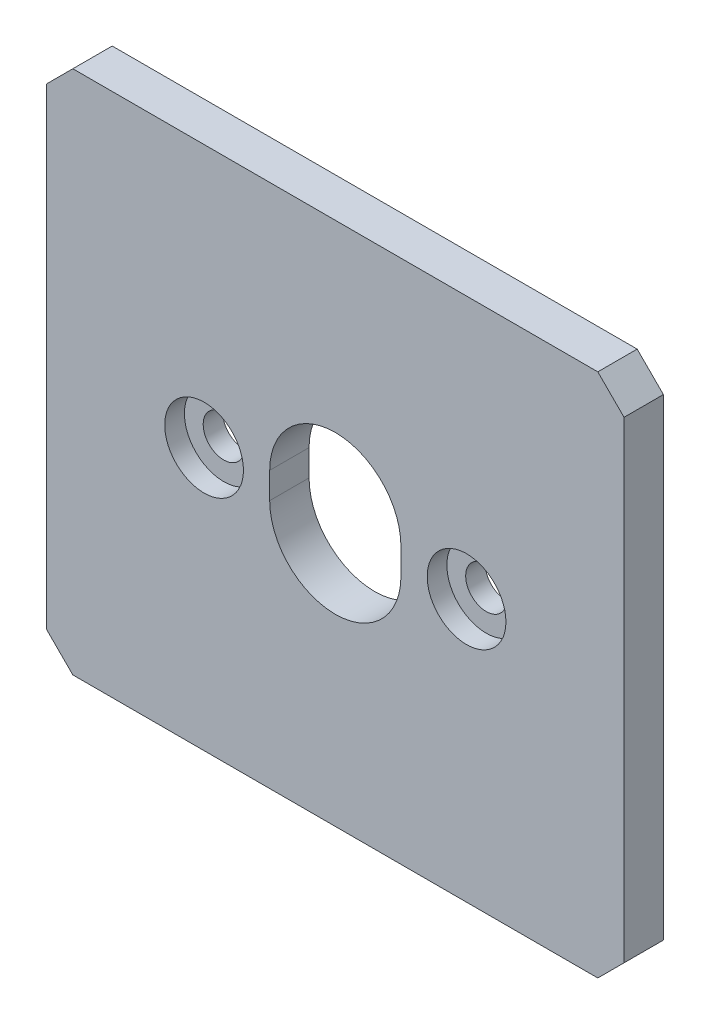
ISO-10303-21;
HEADER;
FILE_DESCRIPTION(('STEP AP214'),'2;1');
FILE_NAME('part.step','',(''),(''),'','','');
FILE_SCHEMA(('AUTOMOTIVE_DESIGN { 1 0 10303 214 1 1 1 1 }'));
ENDSEC;
DATA;
#1=APPLICATION_CONTEXT('core data for automotive mechanical design processes');
#2=APPLICATION_PROTOCOL_DEFINITION('international standard','automotive_design',2000,#1);
#3=PRODUCT_CONTEXT('',#1,'mechanical');
#4=PRODUCT('Part','Part','',(#3));
#5=PRODUCT_RELATED_PRODUCT_CATEGORY('part','',(#4));
#6=PRODUCT_DEFINITION_FORMATION('','',#4);
#7=PRODUCT_DEFINITION_CONTEXT('part definition',#1,'design');
#8=PRODUCT_DEFINITION('design','',#6,#7);
#9=PRODUCT_DEFINITION_SHAPE('','',#8);
#10=(LENGTH_UNIT() NAMED_UNIT(*) SI_UNIT(.MILLI.,.METRE.));
#11=(NAMED_UNIT(*) PLANE_ANGLE_UNIT() SI_UNIT($,.RADIAN.));
#12=(NAMED_UNIT(*) SI_UNIT($,.STERADIAN.) SOLID_ANGLE_UNIT());
#13=UNCERTAINTY_MEASURE_WITH_UNIT(LENGTH_MEASURE(1.E-05),#10,'distance_accuracy_value','');
#14=(GEOMETRIC_REPRESENTATION_CONTEXT(3) GLOBAL_UNCERTAINTY_ASSIGNED_CONTEXT((#13)) GLOBAL_UNIT_ASSIGNED_CONTEXT((#10,
#11,#12)) REPRESENTATION_CONTEXT('',''));
#15=CARTESIAN_POINT('',(0.,0.,0.));
#16=DIRECTION('',(0.,0.,1.));
#17=DIRECTION('',(1.,0.,0.));
#18=AXIS2_PLACEMENT_3D('',#15,#16,#17);
#19=CARTESIAN_POINT('',(-15.875,0.,4.7625));
#20=DIRECTION('',(0.,0.,-1.));
#21=DIRECTION('',(-1.,0.,0.));
#22=AXIS2_PLACEMENT_3D('',#19,#20,#21);
#23=CYLINDRICAL_SURFACE('',#22,2.4892);
#24=CARTESIAN_POINT('',(-15.875,0.,0.));
#25=DIRECTION('',(0.,0.,1.));
#26=DIRECTION('',(1.,0.,0.));
#27=AXIS2_PLACEMENT_3D('',#24,#25,#26);
#28=CIRCLE('',#27,2.4892);
#29=CARTESIAN_POINT('',(-18.3642,0.,0.));
#30=VERTEX_POINT('',#29);
#31=EDGE_CURVE('E161',#30,#30,#28,.T.);
#32=CARTESIAN_POINT('',(-15.875,0.,2.38125));
#33=DIRECTION('',(0.,0.,1.));
#34=DIRECTION('',(1.,0.,0.));
#35=AXIS2_PLACEMENT_3D('',#32,#33,#34);
#36=CIRCLE('',#35,2.4892);
#37=CARTESIAN_POINT('',(-18.3642,0.,2.38125));
#38=VERTEX_POINT('',#37);
#39=EDGE_CURVE('E40',#38,#38,#36,.T.);
#40=CARTESIAN_POINT('',(-18.3642,0.,0.));
#41=CARTESIAN_POINT('',(-18.3642,0.,0.0248046875));
#42=CARTESIAN_POINT('',(-18.3642,0.,0.049609375));
#43=CARTESIAN_POINT('',(-18.3642,0.,0.0992187500000001));
#44=CARTESIAN_POINT('',(-18.3642,0.,0.1240234375));
#45=CARTESIAN_POINT('',(-18.3642,0.,0.1736328125));
#46=CARTESIAN_POINT('',(-18.3642,0.,0.1984375));
#47=CARTESIAN_POINT('',(-18.3642,0.,0.248046875));
#48=CARTESIAN_POINT('',(-18.3642,0.,0.2728515625));
#49=CARTESIAN_POINT('',(-18.3642,0.,0.3224609375));
#50=CARTESIAN_POINT('',(-18.3642,0.,0.347265625));
#51=CARTESIAN_POINT('',(-18.3642,0.,0.396875));
#52=CARTESIAN_POINT('',(-18.3642,0.,0.4216796875));
#53=CARTESIAN_POINT('',(-18.3642,0.,0.4712890625));
#54=CARTESIAN_POINT('',(-18.3642,0.,0.49609375));
#55=CARTESIAN_POINT('',(-18.3642,0.,0.545703125));
#56=CARTESIAN_POINT('',(-18.3642,0.,0.5705078125));
#57=CARTESIAN_POINT('',(-18.3642,0.,0.6201171875));
#58=CARTESIAN_POINT('',(-18.3642,0.,0.644921875));
#59=CARTESIAN_POINT('',(-18.3642,0.,0.69453125));
#60=CARTESIAN_POINT('',(-18.3642,0.,0.7193359375));
#61=CARTESIAN_POINT('',(-18.3642,0.,0.7689453125));
#62=CARTESIAN_POINT('',(-18.3642,0.,0.793750000000001));
#63=CARTESIAN_POINT('',(-18.3642,0.,0.843359375));
#64=CARTESIAN_POINT('',(-18.3642,0.,0.8681640625));
#65=CARTESIAN_POINT('',(-18.3642,0.,0.9177734375));
#66=CARTESIAN_POINT('',(-18.3642,0.,0.942578125));
#67=CARTESIAN_POINT('',(-18.3642,0.,0.9921875));
#68=CARTESIAN_POINT('',(-18.3642,0.,1.0169921875));
#69=CARTESIAN_POINT('',(-18.3642,0.,1.0666015625));
#70=CARTESIAN_POINT('',(-18.3642,0.,1.09140625));
#71=CARTESIAN_POINT('',(-18.3642,0.,1.141015625));
#72=CARTESIAN_POINT('',(-18.3642,0.,1.1658203125));
#73=CARTESIAN_POINT('',(-18.3642,0.,1.2154296875));
#74=CARTESIAN_POINT('',(-18.3642,0.,1.240234375));
#75=CARTESIAN_POINT('',(-18.3642,0.,1.28984375));
#76=CARTESIAN_POINT('',(-18.3642,0.,1.3146484375));
#77=CARTESIAN_POINT('',(-18.3642,0.,1.3642578125));
#78=CARTESIAN_POINT('',(-18.3642,0.,1.3890625));
#79=CARTESIAN_POINT('',(-18.3642,0.,1.438671875));
#80=CARTESIAN_POINT('',(-18.3642,0.,1.4634765625));
#81=CARTESIAN_POINT('',(-18.3642,0.,1.5130859375));
#82=CARTESIAN_POINT('',(-18.3642,0.,1.537890625));
#83=CARTESIAN_POINT('',(-18.3642,0.,1.5875));
#84=CARTESIAN_POINT('',(-18.3642,0.,1.6123046875));
#85=CARTESIAN_POINT('',(-18.3642,0.,1.6619140625));
#86=CARTESIAN_POINT('',(-18.3642,0.,1.68671875));
#87=CARTESIAN_POINT('',(-18.3642,0.,1.736328125));
#88=CARTESIAN_POINT('',(-18.3642,0.,1.7611328125));
#89=CARTESIAN_POINT('',(-18.3642,0.,1.8107421875));
#90=CARTESIAN_POINT('',(-18.3642,0.,1.835546875));
#91=CARTESIAN_POINT('',(-18.3642,0.,1.88515625));
#92=CARTESIAN_POINT('',(-18.3642,0.,1.9099609375));
#93=CARTESIAN_POINT('',(-18.3642,0.,1.9595703125));
#94=CARTESIAN_POINT('',(-18.3642,0.,1.984375));
#95=CARTESIAN_POINT('',(-18.3642,0.,2.033984375));
#96=CARTESIAN_POINT('',(-18.3642,0.,2.0587890625));
#97=CARTESIAN_POINT('',(-18.3642,0.,2.1083984375));
#98=CARTESIAN_POINT('',(-18.3642,0.,2.133203125));
#99=CARTESIAN_POINT('',(-18.3642,0.,2.1828125));
#100=CARTESIAN_POINT('',(-18.3642,0.,2.2076171875));
#101=CARTESIAN_POINT('',(-18.3642,0.,2.2572265625));
#102=CARTESIAN_POINT('',(-18.3642,0.,2.28203125));
#103=CARTESIAN_POINT('',(-18.3642,0.,2.331640625));
#104=CARTESIAN_POINT('',(-18.3642,0.,2.3564453125));
#105=CARTESIAN_POINT('',(-18.3642,0.,2.38125));
#106=B_SPLINE_CURVE_WITH_KNOTS('',3,(#40,#41,#42,#43,#44,#45,#46,#47,#48,#49,#50,#51,#52,#53,
#54,#55,#56,#57,#58,#59,#60,#61,#62,#63,#64,#65,#66,#67,#68,#69,#70,#71,#72,#73,#74,#75,#76,#77,
#78,#79,#80,#81,#82,#83,#84,#85,#86,#87,#88,#89,#90,#91,#92,#93,#94,#95,#96,#97,#98,#99,#100,
#101,#102,#103,#104,#105),.UNSPECIFIED.,.F.,.F.,(4,2,2,2,2,2,2,2,2,2,2,2,2,2,2,2,2,2,2,2,2,2,2,
2,2,2,2,2,2,2,2,2,4),(0.,0.0744140625,0.148828125,0.2232421875,0.29765625,0.3720703125,
0.446484375,0.5208984375,0.5953125,0.6697265625,0.744140625,0.8185546875,0.89296875,
0.9673828125,1.041796875,1.1162109375,1.190625,1.2650390625,1.339453125,1.4138671875,1.48828125,
1.5626953125,1.637109375,1.7115234375,1.7859375,1.8603515625,1.934765625,2.0091796875,
2.08359375,2.1580078125,2.232421875,2.3068359375,2.38125),.UNSPECIFIED.);
#107=EDGE_CURVE('BSEAM36',#30,#38,#106,.T.);
#108=ORIENTED_EDGE('',*,*,#31,.F.);
#109=ORIENTED_EDGE('',*,*,#39,.T.);
#110=ORIENTED_EDGE('',*,*,#107,.T.);
#111=ORIENTED_EDGE('',*,*,#107,.F.);
#112=EDGE_LOOP('',(#108,#110,#109,#111));
#113=FACE_BOUND('',#112,.T.);
#114=ADVANCED_FACE('F36',(#113),#23,.F.);
#115=CARTESIAN_POINT('',(15.875,0.,4.7625));
#116=DIRECTION('',(0.,0.,-1.));
#117=DIRECTION('',(-1.,0.,0.));
#118=AXIS2_PLACEMENT_3D('',#115,#116,#117);
#119=CYLINDRICAL_SURFACE('',#118,2.4892);
#120=CARTESIAN_POINT('',(15.875,0.,0.));
#121=DIRECTION('',(0.,0.,1.));
#122=DIRECTION('',(1.,0.,0.));
#123=AXIS2_PLACEMENT_3D('',#120,#121,#122);
#124=CIRCLE('',#123,2.4892);
#125=CARTESIAN_POINT('',(13.3858,0.,0.));
#126=VERTEX_POINT('',#125);
#127=EDGE_CURVE('E229',#126,#126,#124,.T.);
#128=CARTESIAN_POINT('',(15.875,0.,2.38125));
#129=DIRECTION('',(0.,0.,1.));
#130=DIRECTION('',(1.,0.,0.));
#131=AXIS2_PLACEMENT_3D('',#128,#129,#130);
#132=CIRCLE('',#131,2.4892);
#133=CARTESIAN_POINT('',(13.3858,0.,2.38125));
#134=VERTEX_POINT('',#133);
#135=EDGE_CURVE('E223',#134,#134,#132,.T.);
#136=CARTESIAN_POINT('',(13.3858,0.,0.));
#137=CARTESIAN_POINT('',(13.3858,0.,0.0248046875));
#138=CARTESIAN_POINT('',(13.3858,0.,0.049609375));
#139=CARTESIAN_POINT('',(13.3858,0.,0.0992187500000001));
#140=CARTESIAN_POINT('',(13.3858,0.,0.1240234375));
#141=CARTESIAN_POINT('',(13.3858,0.,0.1736328125));
#142=CARTESIAN_POINT('',(13.3858,0.,0.1984375));
#143=CARTESIAN_POINT('',(13.3858,0.,0.248046875));
#144=CARTESIAN_POINT('',(13.3858,0.,0.2728515625));
#145=CARTESIAN_POINT('',(13.3858,0.,0.3224609375));
#146=CARTESIAN_POINT('',(13.3858,0.,0.347265625));
#147=CARTESIAN_POINT('',(13.3858,0.,0.396875));
#148=CARTESIAN_POINT('',(13.3858,0.,0.4216796875));
#149=CARTESIAN_POINT('',(13.3858,0.,0.4712890625));
#150=CARTESIAN_POINT('',(13.3858,0.,0.49609375));
#151=CARTESIAN_POINT('',(13.3858,0.,0.545703125));
#152=CARTESIAN_POINT('',(13.3858,0.,0.5705078125));
#153=CARTESIAN_POINT('',(13.3858,0.,0.6201171875));
#154=CARTESIAN_POINT('',(13.3858,0.,0.644921875));
#155=CARTESIAN_POINT('',(13.3858,0.,0.69453125));
#156=CARTESIAN_POINT('',(13.3858,0.,0.7193359375));
#157=CARTESIAN_POINT('',(13.3858,0.,0.7689453125));
#158=CARTESIAN_POINT('',(13.3858,0.,0.793750000000001));
#159=CARTESIAN_POINT('',(13.3858,0.,0.843359375));
#160=CARTESIAN_POINT('',(13.3858,0.,0.8681640625));
#161=CARTESIAN_POINT('',(13.3858,0.,0.9177734375));
#162=CARTESIAN_POINT('',(13.3858,0.,0.942578125));
#163=CARTESIAN_POINT('',(13.3858,0.,0.9921875));
#164=CARTESIAN_POINT('',(13.3858,0.,1.0169921875));
#165=CARTESIAN_POINT('',(13.3858,0.,1.0666015625));
#166=CARTESIAN_POINT('',(13.3858,0.,1.09140625));
#167=CARTESIAN_POINT('',(13.3858,0.,1.141015625));
#168=CARTESIAN_POINT('',(13.3858,0.,1.1658203125));
#169=CARTESIAN_POINT('',(13.3858,0.,1.2154296875));
#170=CARTESIAN_POINT('',(13.3858,0.,1.240234375));
#171=CARTESIAN_POINT('',(13.3858,0.,1.28984375));
#172=CARTESIAN_POINT('',(13.3858,0.,1.3146484375));
#173=CARTESIAN_POINT('',(13.3858,0.,1.3642578125));
#174=CARTESIAN_POINT('',(13.3858,0.,1.3890625));
#175=CARTESIAN_POINT('',(13.3858,0.,1.438671875));
#176=CARTESIAN_POINT('',(13.3858,0.,1.4634765625));
#177=CARTESIAN_POINT('',(13.3858,0.,1.5130859375));
#178=CARTESIAN_POINT('',(13.3858,0.,1.537890625));
#179=CARTESIAN_POINT('',(13.3858,0.,1.5875));
#180=CARTESIAN_POINT('',(13.3858,0.,1.6123046875));
#181=CARTESIAN_POINT('',(13.3858,0.,1.6619140625));
#182=CARTESIAN_POINT('',(13.3858,0.,1.68671875));
#183=CARTESIAN_POINT('',(13.3858,0.,1.736328125));
#184=CARTESIAN_POINT('',(13.3858,0.,1.7611328125));
#185=CARTESIAN_POINT('',(13.3858,0.,1.8107421875));
#186=CARTESIAN_POINT('',(13.3858,0.,1.835546875));
#187=CARTESIAN_POINT('',(13.3858,0.,1.88515625));
#188=CARTESIAN_POINT('',(13.3858,0.,1.9099609375));
#189=CARTESIAN_POINT('',(13.3858,0.,1.9595703125));
#190=CARTESIAN_POINT('',(13.3858,0.,1.984375));
#191=CARTESIAN_POINT('',(13.3858,0.,2.033984375));
#192=CARTESIAN_POINT('',(13.3858,0.,2.0587890625));
#193=CARTESIAN_POINT('',(13.3858,0.,2.1083984375));
#194=CARTESIAN_POINT('',(13.3858,0.,2.133203125));
#195=CARTESIAN_POINT('',(13.3858,0.,2.1828125));
#196=CARTESIAN_POINT('',(13.3858,0.,2.2076171875));
#197=CARTESIAN_POINT('',(13.3858,0.,2.2572265625));
#198=CARTESIAN_POINT('',(13.3858,0.,2.28203125));
#199=CARTESIAN_POINT('',(13.3858,0.,2.331640625));
#200=CARTESIAN_POINT('',(13.3858,0.,2.3564453125));
#201=CARTESIAN_POINT('',(13.3858,0.,2.38125));
#202=B_SPLINE_CURVE_WITH_KNOTS('',3,(#136,#137,#138,#139,#140,#141,#142,#143,#144,#145,#146,
#147,#148,#149,#150,#151,#152,#153,#154,#155,#156,#157,#158,#159,#160,#161,#162,#163,#164,#165,
#166,#167,#168,#169,#170,#171,#172,#173,#174,#175,#176,#177,#178,#179,#180,#181,#182,#183,#184,
#185,#186,#187,#188,#189,#190,#191,#192,#193,#194,#195,#196,#197,#198,#199,#200,#201),
.UNSPECIFIED.,.F.,.F.,(4,2,2,2,2,2,2,2,2,2,2,2,2,2,2,2,2,2,2,2,2,2,2,2,2,2,2,2,2,2,2,2,4),(0.,
0.0744140625,0.148828125,0.2232421875,0.29765625,0.3720703125,0.446484375,0.5208984375,
0.5953125,0.6697265625,0.744140625,0.8185546875,0.89296875,0.9673828125,1.041796875,
1.1162109375,1.190625,1.2650390625,1.339453125,1.4138671875,1.48828125,1.5626953125,1.637109375,
1.7115234375,1.7859375,1.8603515625,1.934765625,2.0091796875,2.08359375,2.1580078125,
2.232421875,2.3068359375,2.38125),.UNSPECIFIED.);
#203=EDGE_CURVE('BSEAM253',#126,#134,#202,.T.);
#204=ORIENTED_EDGE('',*,*,#127,.F.);
#205=ORIENTED_EDGE('',*,*,#135,.T.);
#206=ORIENTED_EDGE('',*,*,#203,.T.);
#207=ORIENTED_EDGE('',*,*,#203,.F.);
#208=EDGE_LOOP('',(#204,#206,#205,#207));
#209=FACE_BOUND('',#208,.T.);
#210=ADVANCED_FACE('F253',(#209),#119,.F.);
#211=CARTESIAN_POINT('',(0.,0.,4.7625));
#212=DIRECTION('',(0.,0.,-1.));
#213=DIRECTION('',(-1.,0.,0.));
#214=AXIS2_PLACEMENT_3D('',#211,#212,#213);
#215=PLANE('',#214);
#216=CARTESIAN_POINT('',(-15.875,0.,4.7625));
#217=DIRECTION('',(0.,0.,1.));
#218=DIRECTION('',(1.,0.,0.));
#219=AXIS2_PLACEMENT_3D('',#216,#217,#218);
#220=CIRCLE('',#219,4.7625);
#221=CARTESIAN_POINT('',(-11.1125,0.,4.7625));
#222=VERTEX_POINT('',#221);
#223=EDGE_CURVE('E231',#222,#222,#220,.T.);
#224=ORIENTED_EDGE('',*,*,#223,.F.);
#225=EDGE_LOOP('',(#224));
#226=FACE_BOUND('',#225,.T.);
#227=CARTESIAN_POINT('',(15.875,0.,4.7625));
#228=DIRECTION('',(0.,0.,1.));
#229=DIRECTION('',(1.,0.,0.));
#230=AXIS2_PLACEMENT_3D('',#227,#228,#229);
#231=CIRCLE('',#230,4.7625);
#232=CARTESIAN_POINT('',(20.6375,0.,4.7625));
#233=VERTEX_POINT('',#232);
#234=EDGE_CURVE('E241',#233,#233,#231,.T.);
#235=ORIENTED_EDGE('',*,*,#234,.F.);
#236=EDGE_LOOP('',(#235));
#237=FACE_BOUND('',#236,.T.);
#238=DIRECTION('',(0.,-1.,0.));
#239=VECTOR('',#238,1.);
#240=CARTESIAN_POINT('',(-34.925,-31.75,4.7625));
#241=LINE('',#240,#239);
#242=CARTESIAN_POINT('',(-34.925,28.575,4.7625));
#243=VERTEX_POINT('',#242);
#244=CARTESIAN_POINT('',(-34.925,-28.575,4.7625));
#245=VERTEX_POINT('',#244);
#246=EDGE_CURVE('E177',#243,#245,#241,.T.);
#247=ORIENTED_EDGE('',*,*,#246,.T.);
#248=DIRECTION('',(-0.707106781186546,0.707106781186549,0.));
#249=VECTOR('',#248,1.);
#250=CARTESIAN_POINT('',(-31.75,-31.75,4.7625));
#251=LINE('',#250,#249);
#252=CARTESIAN_POINT('',(-31.75,-31.75,4.7625));
#253=VERTEX_POINT('',#252);
#254=EDGE_CURVE('E215',#245,#253,#251,.F.);
#255=ORIENTED_EDGE('',*,*,#254,.T.);
#256=DIRECTION('',(1.,0.,0.));
#257=VECTOR('',#256,1.);
#258=CARTESIAN_POINT('',(-34.925,-31.75,4.7625));
#259=LINE('',#258,#257);
#260=CARTESIAN_POINT('',(31.75,-31.75,4.7625));
#261=VERTEX_POINT('',#260);
#262=EDGE_CURVE('E180',#253,#261,#259,.T.);
#263=ORIENTED_EDGE('',*,*,#262,.T.);
#264=DIRECTION('',(-0.707106781186551,-0.707106781186544,0.));
#265=VECTOR('',#264,1.);
#266=CARTESIAN_POINT('',(34.925,-28.575,4.7625));
#267=LINE('',#266,#265);
#268=CARTESIAN_POINT('',(34.925,-28.575,4.7625));
#269=VERTEX_POINT('',#268);
#270=EDGE_CURVE('E213',#261,#269,#267,.F.);
#271=ORIENTED_EDGE('',*,*,#270,.T.);
#272=DIRECTION('',(0.,1.,0.));
#273=VECTOR('',#272,1.);
#274=CARTESIAN_POINT('',(34.925,-31.75,4.7625));
#275=LINE('',#274,#273);
#276=CARTESIAN_POINT('',(34.925,28.575,4.7625));
#277=VERTEX_POINT('',#276);
#278=EDGE_CURVE('E172',#269,#277,#275,.T.);
#279=ORIENTED_EDGE('',*,*,#278,.T.);
#280=DIRECTION('',(0.707106781186548,-0.707106781186548,0.));
#281=VECTOR('',#280,1.);
#282=CARTESIAN_POINT('',(31.75,31.75,4.7625));
#283=LINE('',#282,#281);
#284=CARTESIAN_POINT('',(31.75,31.75,4.7625));
#285=VERTEX_POINT('',#284);
#286=EDGE_CURVE('E58',#277,#285,#283,.F.);
#287=ORIENTED_EDGE('',*,*,#286,.T.);
#288=DIRECTION('',(-1.,0.,0.));
#289=VECTOR('',#288,1.);
#290=CARTESIAN_POINT('',(-34.925,31.75,4.7625));
#291=LINE('',#290,#289);
#292=CARTESIAN_POINT('',(-31.75,31.75,4.7625));
#293=VERTEX_POINT('',#292);
#294=EDGE_CURVE('E174',#285,#293,#291,.T.);
#295=ORIENTED_EDGE('',*,*,#294,.T.);
#296=DIRECTION('',(0.707106781186549,0.707106781186546,0.));
#297=VECTOR('',#296,1.);
#298=CARTESIAN_POINT('',(-34.925,28.575,4.7625));
#299=LINE('',#298,#297);
#300=EDGE_CURVE('E211',#293,#243,#299,.F.);
#301=ORIENTED_EDGE('',*,*,#300,.T.);
#302=EDGE_LOOP('',(#247,#255,#263,#271,#279,#287,#295,#301));
#303=FACE_BOUND('',#302,.T.);
#304=CARTESIAN_POINT('',(0.,1.5875,4.7625));
#305=DIRECTION('',(0.,0.,1.));
#306=DIRECTION('',(1.,0.,0.));
#307=AXIS2_PLACEMENT_3D('',#304,#305,#306);
#308=CIRCLE('',#307,7.9375);
#309=CARTESIAN_POINT('',(7.9375,1.5875,4.7625));
#310=VERTEX_POINT('',#309);
#311=CARTESIAN_POINT('',(-7.9375,1.5875,4.7625));
#312=VERTEX_POINT('',#311);
#313=EDGE_CURVE('E128',#310,#312,#308,.T.);
#314=ORIENTED_EDGE('',*,*,#313,.F.);
#315=DIRECTION('',(0.,1.,0.));
#316=VECTOR('',#315,1.);
#317=CARTESIAN_POINT('',(7.9375,1.5875,4.7625));
#318=LINE('',#317,#316);
#319=CARTESIAN_POINT('',(7.9375,-1.5875,4.7625));
#320=VERTEX_POINT('',#319);
#321=EDGE_CURVE('E154',#320,#310,#318,.T.);
#322=ORIENTED_EDGE('',*,*,#321,.F.);
#323=CARTESIAN_POINT('',(0.,-1.5875,4.7625));
#324=DIRECTION('',(0.,0.,1.));
#325=DIRECTION('',(1.,0.,0.));
#326=AXIS2_PLACEMENT_3D('',#323,#324,#325);
#327=CIRCLE('',#326,7.9375);
#328=CARTESIAN_POINT('',(-7.9375,-1.5875,4.7625));
#329=VERTEX_POINT('',#328);
#330=EDGE_CURVE('E152',#329,#320,#327,.T.);
#331=ORIENTED_EDGE('',*,*,#330,.F.);
#332=DIRECTION('',(0.,-1.,0.));
#333=VECTOR('',#332,1.);
#334=CARTESIAN_POINT('',(-7.9375,1.5875,4.7625));
#335=LINE('',#334,#333);
#336=EDGE_CURVE('E138',#312,#329,#335,.T.);
#337=ORIENTED_EDGE('',*,*,#336,.F.);
#338=EDGE_LOOP('',(#314,#322,#331,#337));
#339=FACE_BOUND('',#338,.T.);
#340=ADVANCED_FACE('F150',(#226,#237,#303,#339),#215,.F.);
#341=CARTESIAN_POINT('',(0.,0.,0.));
#342=DIRECTION('',(0.,0.,-1.));
#343=DIRECTION('',(-1.,0.,0.));
#344=AXIS2_PLACEMENT_3D('',#341,#342,#343);
#345=PLANE('',#344);
#346=ORIENTED_EDGE('',*,*,#31,.T.);
#347=EDGE_LOOP('',(#346));
#348=FACE_BOUND('',#347,.T.);
#349=DIRECTION('',(1.,0.,0.));
#350=VECTOR('',#349,1.);
#351=CARTESIAN_POINT('',(-34.925,-31.75,0.));
#352=LINE('',#351,#350);
#353=CARTESIAN_POINT('',(-31.75,-31.75,0.));
#354=VERTEX_POINT('',#353);
#355=CARTESIAN_POINT('',(31.75,-31.75,0.));
#356=VERTEX_POINT('',#355);
#357=EDGE_CURVE('E175',#354,#356,#352,.T.);
#358=ORIENTED_EDGE('',*,*,#357,.F.);
#359=DIRECTION('',(0.707106781186546,-0.707106781186549,0.));
#360=VECTOR('',#359,1.);
#361=CARTESIAN_POINT('',(-31.7500000000001,-31.7499999999999,0.));
#362=LINE('',#361,#360);
#363=CARTESIAN_POINT('',(-34.925,-28.575,0.));
#364=VERTEX_POINT('',#363);
#365=EDGE_CURVE('E203',#354,#364,#362,.F.);
#366=ORIENTED_EDGE('',*,*,#365,.T.);
#367=DIRECTION('',(0.,-1.,0.));
#368=VECTOR('',#367,1.);
#369=CARTESIAN_POINT('',(-34.925,-31.75,0.));
#370=LINE('',#369,#368);
#371=CARTESIAN_POINT('',(-34.925,28.575,0.));
#372=VERTEX_POINT('',#371);
#373=EDGE_CURVE('E188',#372,#364,#370,.T.);
#374=ORIENTED_EDGE('',*,*,#373,.F.);
#375=DIRECTION('',(-0.707106781186549,-0.707106781186546,0.));
#376=VECTOR('',#375,1.);
#377=CARTESIAN_POINT('',(-31.7499999999999,31.7500000000001,0.));
#378=LINE('',#377,#376);
#379=CARTESIAN_POINT('',(-31.75,31.75,0.));
#380=VERTEX_POINT('',#379);
#381=EDGE_CURVE('E199',#372,#380,#378,.F.);
#382=ORIENTED_EDGE('',*,*,#381,.T.);
#383=DIRECTION('',(-1.,0.,0.));
#384=VECTOR('',#383,1.);
#385=CARTESIAN_POINT('',(-34.925,31.75,0.));
#386=LINE('',#385,#384);
#387=CARTESIAN_POINT('',(31.75,31.75,0.));
#388=VERTEX_POINT('',#387);
#389=EDGE_CURVE('E186',#388,#380,#386,.T.);
#390=ORIENTED_EDGE('',*,*,#389,.F.);
#391=DIRECTION('',(-0.707106781186548,0.707106781186548,0.));
#392=VECTOR('',#391,1.);
#393=CARTESIAN_POINT('',(31.75,31.75,0.));
#394=LINE('',#393,#392);
#395=CARTESIAN_POINT('',(34.925,28.575,0.));
#396=VERTEX_POINT('',#395);
#397=EDGE_CURVE('E197',#388,#396,#394,.F.);
#398=ORIENTED_EDGE('',*,*,#397,.T.);
#399=DIRECTION('',(0.,1.,0.));
#400=VECTOR('',#399,1.);
#401=CARTESIAN_POINT('',(34.925,-31.75,0.));
#402=LINE('',#401,#400);
#403=CARTESIAN_POINT('',(34.925,-28.575,0.));
#404=VERTEX_POINT('',#403);
#405=EDGE_CURVE('E146',#404,#396,#402,.T.);
#406=ORIENTED_EDGE('',*,*,#405,.F.);
#407=DIRECTION('',(0.707106781186551,0.707106781186544,0.));
#408=VECTOR('',#407,1.);
#409=CARTESIAN_POINT('',(31.7499999999999,-31.7500000000001,0.));
#410=LINE('',#409,#408);
#411=EDGE_CURVE('E201',#404,#356,#410,.F.);
#412=ORIENTED_EDGE('',*,*,#411,.T.);
#413=EDGE_LOOP('',(#358,#366,#374,#382,#390,#398,#406,#412));
#414=FACE_BOUND('',#413,.T.);
#415=DIRECTION('',(0.,1.,0.));
#416=VECTOR('',#415,1.);
#417=CARTESIAN_POINT('',(7.9375,1.5875,0.));
#418=LINE('',#417,#416);
#419=CARTESIAN_POINT('',(7.9375,-1.5875,0.));
#420=VERTEX_POINT('',#419);
#421=CARTESIAN_POINT('',(7.9375,1.5875,0.));
#422=VERTEX_POINT('',#421);
#423=EDGE_CURVE('E139',#420,#422,#418,.T.);
#424=ORIENTED_EDGE('',*,*,#423,.T.);
#425=CARTESIAN_POINT('',(0.,1.5875,0.));
#426=DIRECTION('',(0.,0.,1.));
#427=DIRECTION('',(1.,0.,0.));
#428=AXIS2_PLACEMENT_3D('',#425,#426,#427);
#429=CIRCLE('',#428,7.9375);
#430=CARTESIAN_POINT('',(-7.9375,1.5875,0.));
#431=VERTEX_POINT('',#430);
#432=EDGE_CURVE('E159',#422,#431,#429,.T.);
#433=ORIENTED_EDGE('',*,*,#432,.T.);
#434=DIRECTION('',(0.,-1.,0.));
#435=VECTOR('',#434,1.);
#436=CARTESIAN_POINT('',(-7.9375,1.5875,0.));
#437=LINE('',#436,#435);
#438=CARTESIAN_POINT('',(-7.9375,-1.5875,0.));
#439=VERTEX_POINT('',#438);
#440=EDGE_CURVE('E145',#431,#439,#437,.T.);
#441=ORIENTED_EDGE('',*,*,#440,.T.);
#442=CARTESIAN_POINT('',(0.,-1.5875,0.));
#443=DIRECTION('',(0.,0.,1.));
#444=DIRECTION('',(1.,0.,0.));
#445=AXIS2_PLACEMENT_3D('',#442,#443,#444);
#446=CIRCLE('',#445,7.9375);
#447=EDGE_CURVE('E163',#439,#420,#446,.T.);
#448=ORIENTED_EDGE('',*,*,#447,.T.);
#449=EDGE_LOOP('',(#424,#433,#441,#448));
#450=FACE_BOUND('',#449,.T.);
#451=ORIENTED_EDGE('',*,*,#127,.T.);
#452=EDGE_LOOP('',(#451));
#453=FACE_BOUND('',#452,.T.);
#454=ADVANCED_FACE('F248',(#348,#414,#450,#453),#345,.T.);
#455=CARTESIAN_POINT('',(34.925,-31.75,4.7625));
#456=DIRECTION('',(-1.,0.,0.));
#457=DIRECTION('',(0.,0.,1.));
#458=AXIS2_PLACEMENT_3D('',#455,#456,#457);
#459=PLANE('',#458);
#460=ORIENTED_EDGE('',*,*,#278,.F.);
#461=DIRECTION('',(0.,0.,-1.));
#462=VECTOR('',#461,1.);
#463=CARTESIAN_POINT('',(34.925,-28.575,4.7625));
#464=LINE('',#463,#462);
#465=EDGE_CURVE('E219',#269,#404,#464,.T.);
#466=ORIENTED_EDGE('',*,*,#465,.T.);
#467=ORIENTED_EDGE('',*,*,#405,.T.);
#468=DIRECTION('',(0.,0.,1.));
#469=VECTOR('',#468,1.);
#470=CARTESIAN_POINT('',(34.925,28.575,4.7625));
#471=LINE('',#470,#469);
#472=EDGE_CURVE('E217',#396,#277,#471,.T.);
#473=ORIENTED_EDGE('',*,*,#472,.T.);
#474=EDGE_LOOP('',(#460,#466,#467,#473));
#475=FACE_BOUND('',#474,.T.);
#476=ADVANCED_FACE('F297',(#475),#459,.F.);
#477=CARTESIAN_POINT('',(-34.925,31.75,4.7625));
#478=DIRECTION('',(0.,-1.,0.));
#479=DIRECTION('',(0.,0.,-1.));
#480=AXIS2_PLACEMENT_3D('',#477,#478,#479);
#481=PLANE('',#480);
#482=ORIENTED_EDGE('',*,*,#389,.T.);
#483=DIRECTION('',(0.,0.,1.));
#484=VECTOR('',#483,1.);
#485=CARTESIAN_POINT('',(-31.75,31.75,4.7625));
#486=LINE('',#485,#484);
#487=EDGE_CURVE('E11',#380,#293,#486,.T.);
#488=ORIENTED_EDGE('',*,*,#487,.T.);
#489=ORIENTED_EDGE('',*,*,#294,.F.);
#490=DIRECTION('',(0.,0.,-1.));
#491=VECTOR('',#490,1.);
#492=CARTESIAN_POINT('',(31.75,31.75,4.7625));
#493=LINE('',#492,#491);
#494=EDGE_CURVE('E45',#285,#388,#493,.T.);
#495=ORIENTED_EDGE('',*,*,#494,.T.);
#496=EDGE_LOOP('',(#482,#488,#489,#495));
#497=FACE_BOUND('',#496,.T.);
#498=ADVANCED_FACE('F304',(#497),#481,.F.);
#499=CARTESIAN_POINT('',(-34.925,-31.75,4.7625));
#500=DIRECTION('',(1.,0.,0.));
#501=DIRECTION('',(0.,0.,-1.));
#502=AXIS2_PLACEMENT_3D('',#499,#500,#501);
#503=PLANE('',#502);
#504=ORIENTED_EDGE('',*,*,#373,.T.);
#505=DIRECTION('',(0.,0.,1.));
#506=VECTOR('',#505,1.);
#507=CARTESIAN_POINT('',(-34.925,-28.575,4.7625));
#508=LINE('',#507,#506);
#509=EDGE_CURVE('E208',#364,#245,#508,.T.);
#510=ORIENTED_EDGE('',*,*,#509,.T.);
#511=ORIENTED_EDGE('',*,*,#246,.F.);
#512=DIRECTION('',(0.,0.,-1.));
#513=VECTOR('',#512,1.);
#514=CARTESIAN_POINT('',(-34.925,28.575,4.7625));
#515=LINE('',#514,#513);
#516=EDGE_CURVE('E205',#243,#372,#515,.T.);
#517=ORIENTED_EDGE('',*,*,#516,.T.);
#518=EDGE_LOOP('',(#504,#510,#511,#517));
#519=FACE_BOUND('',#518,.T.);
#520=ADVANCED_FACE('F300',(#519),#503,.F.);
#521=CARTESIAN_POINT('',(-34.925,-31.75,4.7625));
#522=DIRECTION('',(0.,1.,0.));
#523=DIRECTION('',(0.,0.,1.));
#524=AXIS2_PLACEMENT_3D('',#521,#522,#523);
#525=PLANE('',#524);
#526=ORIENTED_EDGE('',*,*,#262,.F.);
#527=DIRECTION('',(0.,0.,-1.));
#528=VECTOR('',#527,1.);
#529=CARTESIAN_POINT('',(-31.75,-31.75,4.7625));
#530=LINE('',#529,#528);
#531=EDGE_CURVE('E194',#253,#354,#530,.T.);
#532=ORIENTED_EDGE('',*,*,#531,.T.);
#533=ORIENTED_EDGE('',*,*,#357,.T.);
#534=DIRECTION('',(0.,0.,1.));
#535=VECTOR('',#534,1.);
#536=CARTESIAN_POINT('',(31.75,-31.75,4.7625));
#537=LINE('',#536,#535);
#538=EDGE_CURVE('E183',#356,#261,#537,.T.);
#539=ORIENTED_EDGE('',*,*,#538,.T.);
#540=EDGE_LOOP('',(#526,#532,#533,#539));
#541=FACE_BOUND('',#540,.T.);
#542=ADVANCED_FACE('F291',(#541),#525,.F.);
#543=CARTESIAN_POINT('',(0.,1.5875,4.7625));
#544=DIRECTION('',(0.,0.,-1.));
#545=DIRECTION('',(-1.,0.,0.));
#546=AXIS2_PLACEMENT_3D('',#543,#544,#545);
#547=CYLINDRICAL_SURFACE('',#546,7.9375);
#548=ORIENTED_EDGE('',*,*,#432,.F.);
#549=DIRECTION('',(0.,0.,-1.));
#550=VECTOR('',#549,1.);
#551=CARTESIAN_POINT('',(7.9375,1.5875,4.7625));
#552=LINE('',#551,#550);
#553=EDGE_CURVE('E134',#310,#422,#552,.T.);
#554=ORIENTED_EDGE('',*,*,#553,.F.);
#555=ORIENTED_EDGE('',*,*,#313,.T.);
#556=DIRECTION('',(0.,0.,-1.));
#557=VECTOR('',#556,1.);
#558=CARTESIAN_POINT('',(-7.9375,1.5875,4.7625));
#559=LINE('',#558,#557);
#560=EDGE_CURVE('E131',#312,#431,#559,.T.);
#561=ORIENTED_EDGE('',*,*,#560,.T.);
#562=EDGE_LOOP('',(#548,#554,#555,#561));
#563=FACE_BOUND('',#562,.T.);
#564=ADVANCED_FACE('F130',(#563),#547,.F.);
#565=CARTESIAN_POINT('',(-7.9375,1.5875,4.7625));
#566=DIRECTION('',(1.,0.,0.));
#567=DIRECTION('',(0.,0.,-1.));
#568=AXIS2_PLACEMENT_3D('',#565,#566,#567);
#569=PLANE('',#568);
#570=ORIENTED_EDGE('',*,*,#440,.F.);
#571=ORIENTED_EDGE('',*,*,#560,.F.);
#572=ORIENTED_EDGE('',*,*,#336,.T.);
#573=DIRECTION('',(0.,0.,-1.));
#574=VECTOR('',#573,1.);
#575=CARTESIAN_POINT('',(-7.9375,-1.5875,4.7625));
#576=LINE('',#575,#574);
#577=EDGE_CURVE('E147',#329,#439,#576,.T.);
#578=ORIENTED_EDGE('',*,*,#577,.T.);
#579=EDGE_LOOP('',(#570,#571,#572,#578));
#580=FACE_BOUND('',#579,.T.);
#581=ADVANCED_FACE('F142',(#580),#569,.T.);
#582=CARTESIAN_POINT('',(0.,-1.5875,4.7625));
#583=DIRECTION('',(0.,0.,-1.));
#584=DIRECTION('',(-1.,0.,0.));
#585=AXIS2_PLACEMENT_3D('',#582,#583,#584);
#586=CYLINDRICAL_SURFACE('',#585,7.9375);
#587=ORIENTED_EDGE('',*,*,#447,.F.);
#588=ORIENTED_EDGE('',*,*,#577,.F.);
#589=ORIENTED_EDGE('',*,*,#330,.T.);
#590=DIRECTION('',(0.,0.,-1.));
#591=VECTOR('',#590,1.);
#592=CARTESIAN_POINT('',(7.9375,-1.5875,4.7625));
#593=LINE('',#592,#591);
#594=EDGE_CURVE('E169',#320,#420,#593,.T.);
#595=ORIENTED_EDGE('',*,*,#594,.T.);
#596=EDGE_LOOP('',(#587,#588,#589,#595));
#597=FACE_BOUND('',#596,.T.);
#598=ADVANCED_FACE('F282',(#597),#586,.F.);
#599=CARTESIAN_POINT('',(7.9375,1.5875,4.7625));
#600=DIRECTION('',(-1.,0.,0.));
#601=DIRECTION('',(0.,0.,1.));
#602=AXIS2_PLACEMENT_3D('',#599,#600,#601);
#603=PLANE('',#602);
#604=ORIENTED_EDGE('',*,*,#423,.F.);
#605=ORIENTED_EDGE('',*,*,#594,.F.);
#606=ORIENTED_EDGE('',*,*,#321,.T.);
#607=ORIENTED_EDGE('',*,*,#553,.T.);
#608=EDGE_LOOP('',(#604,#605,#606,#607));
#609=FACE_BOUND('',#608,.T.);
#610=ADVANCED_FACE('F278',(#609),#603,.T.);
#611=CARTESIAN_POINT('',(-31.75,-31.75,4.7625));
#612=DIRECTION('',(0.707106781186549,0.707106781186546,0.));
#613=DIRECTION('',(0.,0.,-1.));
#614=AXIS2_PLACEMENT_3D('',#611,#612,#613);
#615=PLANE('',#614);
#616=ORIENTED_EDGE('',*,*,#254,.F.);
#617=ORIENTED_EDGE('',*,*,#509,.F.);
#618=ORIENTED_EDGE('',*,*,#365,.F.);
#619=ORIENTED_EDGE('',*,*,#531,.F.);
#620=EDGE_LOOP('',(#616,#617,#618,#619));
#621=FACE_BOUND('',#620,.T.);
#622=ADVANCED_FACE('F281',(#621),#615,.F.);
#623=CARTESIAN_POINT('',(34.925,-28.575,4.7625));
#624=DIRECTION('',(-0.707106781186544,0.707106781186551,0.));
#625=DIRECTION('',(0.,0.,-1.));
#626=AXIS2_PLACEMENT_3D('',#623,#624,#625);
#627=PLANE('',#626);
#628=ORIENTED_EDGE('',*,*,#270,.F.);
#629=ORIENTED_EDGE('',*,*,#538,.F.);
#630=ORIENTED_EDGE('',*,*,#411,.F.);
#631=ORIENTED_EDGE('',*,*,#465,.F.);
#632=EDGE_LOOP('',(#628,#629,#630,#631));
#633=FACE_BOUND('',#632,.T.);
#634=ADVANCED_FACE('F313',(#633),#627,.F.);
#635=CARTESIAN_POINT('',(-34.925,28.575,4.7625));
#636=DIRECTION('',(0.707106781186546,-0.707106781186549,0.));
#637=DIRECTION('',(0.,0.,-1.));
#638=AXIS2_PLACEMENT_3D('',#635,#636,#637);
#639=PLANE('',#638);
#640=ORIENTED_EDGE('',*,*,#300,.F.);
#641=ORIENTED_EDGE('',*,*,#487,.F.);
#642=ORIENTED_EDGE('',*,*,#381,.F.);
#643=ORIENTED_EDGE('',*,*,#516,.F.);
#644=EDGE_LOOP('',(#640,#641,#642,#643));
#645=FACE_BOUND('',#644,.T.);
#646=ADVANCED_FACE('F316',(#645),#639,.F.);
#647=CARTESIAN_POINT('',(31.75,31.75,4.7625));
#648=DIRECTION('',(-0.707106781186548,-0.707106781186548,0.));
#649=DIRECTION('',(0.,0.,-1.));
#650=AXIS2_PLACEMENT_3D('',#647,#648,#649);
#651=PLANE('',#650);
#652=ORIENTED_EDGE('',*,*,#286,.F.);
#653=ORIENTED_EDGE('',*,*,#472,.F.);
#654=ORIENTED_EDGE('',*,*,#397,.F.);
#655=ORIENTED_EDGE('',*,*,#494,.F.);
#656=EDGE_LOOP('',(#652,#653,#654,#655));
#657=FACE_BOUND('',#656,.T.);
#658=ADVANCED_FACE('F38',(#657),#651,.F.);
#659=CARTESIAN_POINT('',(15.875,0.,2.38125));
#660=DIRECTION('',(0.,0.,1.));
#661=DIRECTION('',(1.,0.,0.));
#662=AXIS2_PLACEMENT_3D('',#659,#660,#661);
#663=CYLINDRICAL_SURFACE('',#662,4.7625);
#664=CARTESIAN_POINT('',(15.875,0.,2.38125));
#665=DIRECTION('',(0.,0.,1.));
#666=DIRECTION('',(1.,0.,0.));
#667=AXIS2_PLACEMENT_3D('',#664,#665,#666);
#668=CIRCLE('',#667,4.7625);
#669=CARTESIAN_POINT('',(20.6375,0.,2.38125));
#670=VERTEX_POINT('',#669);
#671=EDGE_CURVE('E236',#670,#670,#668,.T.);
#672=CARTESIAN_POINT('',(20.6375,0.,2.38125));
#673=CARTESIAN_POINT('',(20.6375,0.,2.4060546875));
#674=CARTESIAN_POINT('',(20.6375,0.,2.430859375));
#675=CARTESIAN_POINT('',(20.6375,0.,2.48046875));
#676=CARTESIAN_POINT('',(20.6375,0.,2.5052734375));
#677=CARTESIAN_POINT('',(20.6375,0.,2.5548828125));
#678=CARTESIAN_POINT('',(20.6375,0.,2.5796875));
#679=CARTESIAN_POINT('',(20.6375,0.,2.629296875));
#680=CARTESIAN_POINT('',(20.6375,0.,2.6541015625));
#681=CARTESIAN_POINT('',(20.6375,0.,2.7037109375));
#682=CARTESIAN_POINT('',(20.6375,0.,2.728515625));
#683=CARTESIAN_POINT('',(20.6375,0.,2.778125));
#684=CARTESIAN_POINT('',(20.6375,0.,2.8029296875));
#685=CARTESIAN_POINT('',(20.6375,0.,2.8525390625));
#686=CARTESIAN_POINT('',(20.6375,0.,2.87734375));
#687=CARTESIAN_POINT('',(20.6375,0.,2.926953125));
#688=CARTESIAN_POINT('',(20.6375,0.,2.9517578125));
#689=CARTESIAN_POINT('',(20.6375,0.,3.0013671875));
#690=CARTESIAN_POINT('',(20.6375,0.,3.026171875));
#691=CARTESIAN_POINT('',(20.6375,0.,3.07578125));
#692=CARTESIAN_POINT('',(20.6375,0.,3.1005859375));
#693=CARTESIAN_POINT('',(20.6375,0.,3.1501953125));
#694=CARTESIAN_POINT('',(20.6375,0.,3.175));
#695=CARTESIAN_POINT('',(20.6375,0.,3.224609375));
#696=CARTESIAN_POINT('',(20.6375,0.,3.2494140625));
#697=CARTESIAN_POINT('',(20.6375,0.,3.2990234375));
#698=CARTESIAN_POINT('',(20.6375,0.,3.323828125));
#699=CARTESIAN_POINT('',(20.6375,0.,3.3734375));
#700=CARTESIAN_POINT('',(20.6375,0.,3.3982421875));
#701=CARTESIAN_POINT('',(20.6375,0.,3.4478515625));
#702=CARTESIAN_POINT('',(20.6375,0.,3.47265625));
#703=CARTESIAN_POINT('',(20.6375,0.,3.522265625));
#704=CARTESIAN_POINT('',(20.6375,0.,3.5470703125));
#705=CARTESIAN_POINT('',(20.6375,0.,3.5966796875));
#706=CARTESIAN_POINT('',(20.6375,0.,3.621484375));
#707=CARTESIAN_POINT('',(20.6375,0.,3.67109375));
#708=CARTESIAN_POINT('',(20.6375,0.,3.6958984375));
#709=CARTESIAN_POINT('',(20.6375,0.,3.7455078125));
#710=CARTESIAN_POINT('',(20.6375,0.,3.7703125));
#711=CARTESIAN_POINT('',(20.6375,0.,3.819921875));
#712=CARTESIAN_POINT('',(20.6375,0.,3.8447265625));
#713=CARTESIAN_POINT('',(20.6375,0.,3.8943359375));
#714=CARTESIAN_POINT('',(20.6375,0.,3.919140625));
#715=CARTESIAN_POINT('',(20.6375,0.,3.96875));
#716=CARTESIAN_POINT('',(20.6375,0.,3.9935546875));
#717=CARTESIAN_POINT('',(20.6375,0.,4.0431640625));
#718=CARTESIAN_POINT('',(20.6375,0.,4.06796875));
#719=CARTESIAN_POINT('',(20.6375,0.,4.117578125));
#720=CARTESIAN_POINT('',(20.6375,0.,4.1423828125));
#721=CARTESIAN_POINT('',(20.6375,0.,4.1919921875));
#722=CARTESIAN_POINT('',(20.6375,0.,4.216796875));
#723=CARTESIAN_POINT('',(20.6375,0.,4.26640625));
#724=CARTESIAN_POINT('',(20.6375,0.,4.2912109375));
#725=CARTESIAN_POINT('',(20.6375,0.,4.3408203125));
#726=CARTESIAN_POINT('',(20.6375,0.,4.365625));
#727=CARTESIAN_POINT('',(20.6375,0.,4.415234375));
#728=CARTESIAN_POINT('',(20.6375,0.,4.4400390625));
#729=CARTESIAN_POINT('',(20.6375,0.,4.4896484375));
#730=CARTESIAN_POINT('',(20.6375,0.,4.514453125));
#731=CARTESIAN_POINT('',(20.6375,0.,4.5640625));
#732=CARTESIAN_POINT('',(20.6375,0.,4.5888671875));
#733=CARTESIAN_POINT('',(20.6375,0.,4.6384765625));
#734=CARTESIAN_POINT('',(20.6375,0.,4.66328125));
#735=CARTESIAN_POINT('',(20.6375,0.,4.712890625));
#736=CARTESIAN_POINT('',(20.6375,0.,4.7376953125));
#737=CARTESIAN_POINT('',(20.6375,0.,4.7625));
#738=B_SPLINE_CURVE_WITH_KNOTS('',3,(#672,#673,#674,#675,#676,#677,#678,#679,#680,#681,#682,
#683,#684,#685,#686,#687,#688,#689,#690,#691,#692,#693,#694,#695,#696,#697,#698,#699,#700,#701,
#702,#703,#704,#705,#706,#707,#708,#709,#710,#711,#712,#713,#714,#715,#716,#717,#718,#719,#720,
#721,#722,#723,#724,#725,#726,#727,#728,#729,#730,#731,#732,#733,#734,#735,#736,#737),
.UNSPECIFIED.,.F.,.F.,(4,2,2,2,2,2,2,2,2,2,2,2,2,2,2,2,2,2,2,2,2,2,2,2,2,2,2,2,2,2,2,2,4),(0.,
0.0744140625,0.148828125,0.2232421875,0.29765625,0.3720703125,0.446484375,0.5208984375,
0.5953125,0.6697265625,0.744140625,0.8185546875,0.892968750000001,0.967382812500001,1.041796875,
1.1162109375,1.190625,1.2650390625,1.339453125,1.4138671875,1.48828125,1.5626953125,1.637109375,
1.7115234375,1.7859375,1.8603515625,1.934765625,2.0091796875,2.08359375,2.1580078125,
2.232421875,2.3068359375,2.38125),.UNSPECIFIED.);
#739=EDGE_CURVE('BSEAM270',#670,#233,#738,.T.);
#740=ORIENTED_EDGE('',*,*,#671,.F.);
#741=ORIENTED_EDGE('',*,*,#234,.T.);
#742=ORIENTED_EDGE('',*,*,#739,.T.);
#743=ORIENTED_EDGE('',*,*,#739,.F.);
#744=EDGE_LOOP('',(#740,#742,#741,#743));
#745=FACE_BOUND('',#744,.T.);
#746=ADVANCED_FACE('F270',(#745),#663,.F.);
#747=CARTESIAN_POINT('',(15.875,0.,2.38125));
#748=DIRECTION('',(0.,0.,1.));
#749=DIRECTION('',(1.,0.,0.));
#750=AXIS2_PLACEMENT_3D('',#747,#748,#749);
#751=PLANE('',#750);
#752=ORIENTED_EDGE('',*,*,#135,.F.);
#753=EDGE_LOOP('',(#752));
#754=FACE_BOUND('',#753,.T.);
#755=ORIENTED_EDGE('',*,*,#671,.T.);
#756=EDGE_LOOP('',(#755));
#757=FACE_BOUND('',#756,.T.);
#758=ADVANCED_FACE('F264',(#754,#757),#751,.T.);
#759=CARTESIAN_POINT('',(-15.875,0.,2.38125));
#760=DIRECTION('',(0.,0.,1.));
#761=DIRECTION('',(1.,0.,0.));
#762=AXIS2_PLACEMENT_3D('',#759,#760,#761);
#763=CYLINDRICAL_SURFACE('',#762,4.7625);
#764=CARTESIAN_POINT('',(-15.875,0.,2.38125));
#765=DIRECTION('',(0.,0.,1.));
#766=DIRECTION('',(1.,0.,0.));
#767=AXIS2_PLACEMENT_3D('',#764,#765,#766);
#768=CIRCLE('',#767,4.7625);
#769=CARTESIAN_POINT('',(-11.1125,0.,2.38125));
#770=VERTEX_POINT('',#769);
#771=EDGE_CURVE('E225',#770,#770,#768,.T.);
#772=CARTESIAN_POINT('',(-11.1125,0.,2.38125));
#773=CARTESIAN_POINT('',(-11.1125,0.,2.4060546875));
#774=CARTESIAN_POINT('',(-11.1125,0.,2.430859375));
#775=CARTESIAN_POINT('',(-11.1125,0.,2.48046875));
#776=CARTESIAN_POINT('',(-11.1125,0.,2.5052734375));
#777=CARTESIAN_POINT('',(-11.1125,0.,2.5548828125));
#778=CARTESIAN_POINT('',(-11.1125,0.,2.5796875));
#779=CARTESIAN_POINT('',(-11.1125,0.,2.629296875));
#780=CARTESIAN_POINT('',(-11.1125,0.,2.6541015625));
#781=CARTESIAN_POINT('',(-11.1125,0.,2.7037109375));
#782=CARTESIAN_POINT('',(-11.1125,0.,2.728515625));
#783=CARTESIAN_POINT('',(-11.1125,0.,2.778125));
#784=CARTESIAN_POINT('',(-11.1125,0.,2.8029296875));
#785=CARTESIAN_POINT('',(-11.1125,0.,2.8525390625));
#786=CARTESIAN_POINT('',(-11.1125,0.,2.87734375));
#787=CARTESIAN_POINT('',(-11.1125,0.,2.926953125));
#788=CARTESIAN_POINT('',(-11.1125,0.,2.9517578125));
#789=CARTESIAN_POINT('',(-11.1125,0.,3.0013671875));
#790=CARTESIAN_POINT('',(-11.1125,0.,3.026171875));
#791=CARTESIAN_POINT('',(-11.1125,0.,3.07578125));
#792=CARTESIAN_POINT('',(-11.1125,0.,3.1005859375));
#793=CARTESIAN_POINT('',(-11.1125,0.,3.1501953125));
#794=CARTESIAN_POINT('',(-11.1125,0.,3.175));
#795=CARTESIAN_POINT('',(-11.1125,0.,3.224609375));
#796=CARTESIAN_POINT('',(-11.1125,0.,3.2494140625));
#797=CARTESIAN_POINT('',(-11.1125,0.,3.2990234375));
#798=CARTESIAN_POINT('',(-11.1125,0.,3.323828125));
#799=CARTESIAN_POINT('',(-11.1125,0.,3.3734375));
#800=CARTESIAN_POINT('',(-11.1125,0.,3.3982421875));
#801=CARTESIAN_POINT('',(-11.1125,0.,3.4478515625));
#802=CARTESIAN_POINT('',(-11.1125,0.,3.47265625));
#803=CARTESIAN_POINT('',(-11.1125,0.,3.522265625));
#804=CARTESIAN_POINT('',(-11.1125,0.,3.5470703125));
#805=CARTESIAN_POINT('',(-11.1125,0.,3.5966796875));
#806=CARTESIAN_POINT('',(-11.1125,0.,3.621484375));
#807=CARTESIAN_POINT('',(-11.1125,0.,3.67109375));
#808=CARTESIAN_POINT('',(-11.1125,0.,3.6958984375));
#809=CARTESIAN_POINT('',(-11.1125,0.,3.7455078125));
#810=CARTESIAN_POINT('',(-11.1125,0.,3.7703125));
#811=CARTESIAN_POINT('',(-11.1125,0.,3.819921875));
#812=CARTESIAN_POINT('',(-11.1125,0.,3.8447265625));
#813=CARTESIAN_POINT('',(-11.1125,0.,3.8943359375));
#814=CARTESIAN_POINT('',(-11.1125,0.,3.919140625));
#815=CARTESIAN_POINT('',(-11.1125,0.,3.96875));
#816=CARTESIAN_POINT('',(-11.1125,0.,3.9935546875));
#817=CARTESIAN_POINT('',(-11.1125,0.,4.0431640625));
#818=CARTESIAN_POINT('',(-11.1125,0.,4.06796875));
#819=CARTESIAN_POINT('',(-11.1125,0.,4.117578125));
#820=CARTESIAN_POINT('',(-11.1125,0.,4.1423828125));
#821=CARTESIAN_POINT('',(-11.1125,0.,4.1919921875));
#822=CARTESIAN_POINT('',(-11.1125,0.,4.216796875));
#823=CARTESIAN_POINT('',(-11.1125,0.,4.26640625));
#824=CARTESIAN_POINT('',(-11.1125,0.,4.2912109375));
#825=CARTESIAN_POINT('',(-11.1125,0.,4.3408203125));
#826=CARTESIAN_POINT('',(-11.1125,0.,4.365625));
#827=CARTESIAN_POINT('',(-11.1125,0.,4.415234375));
#828=CARTESIAN_POINT('',(-11.1125,0.,4.4400390625));
#829=CARTESIAN_POINT('',(-11.1125,0.,4.4896484375));
#830=CARTESIAN_POINT('',(-11.1125,0.,4.514453125));
#831=CARTESIAN_POINT('',(-11.1125,0.,4.5640625));
#832=CARTESIAN_POINT('',(-11.1125,0.,4.5888671875));
#833=CARTESIAN_POINT('',(-11.1125,0.,4.6384765625));
#834=CARTESIAN_POINT('',(-11.1125,0.,4.66328125));
#835=CARTESIAN_POINT('',(-11.1125,0.,4.712890625));
#836=CARTESIAN_POINT('',(-11.1125,0.,4.7376953125));
#837=CARTESIAN_POINT('',(-11.1125,0.,4.7625));
#838=B_SPLINE_CURVE_WITH_KNOTS('',3,(#772,#773,#774,#775,#776,#777,#778,#779,#780,#781,#782,
#783,#784,#785,#786,#787,#788,#789,#790,#791,#792,#793,#794,#795,#796,#797,#798,#799,#800,#801,
#802,#803,#804,#805,#806,#807,#808,#809,#810,#811,#812,#813,#814,#815,#816,#817,#818,#819,#820,
#821,#822,#823,#824,#825,#826,#827,#828,#829,#830,#831,#832,#833,#834,#835,#836,#837),
.UNSPECIFIED.,.F.,.F.,(4,2,2,2,2,2,2,2,2,2,2,2,2,2,2,2,2,2,2,2,2,2,2,2,2,2,2,2,2,2,2,2,4),(0.,
0.0744140625,0.148828125,0.2232421875,0.29765625,0.3720703125,0.446484375,0.5208984375,
0.5953125,0.6697265625,0.744140625,0.8185546875,0.892968750000001,0.967382812500001,1.041796875,
1.1162109375,1.190625,1.2650390625,1.339453125,1.4138671875,1.48828125,1.5626953125,1.637109375,
1.7115234375,1.7859375,1.8603515625,1.934765625,2.0091796875,2.08359375,2.1580078125,
2.232421875,2.3068359375,2.38125),.UNSPECIFIED.);
#839=EDGE_CURVE('BSEAM259',#770,#222,#838,.T.);
#840=ORIENTED_EDGE('',*,*,#771,.F.);
#841=ORIENTED_EDGE('',*,*,#223,.T.);
#842=ORIENTED_EDGE('',*,*,#839,.T.);
#843=ORIENTED_EDGE('',*,*,#839,.F.);
#844=EDGE_LOOP('',(#840,#842,#841,#843));
#845=FACE_BOUND('',#844,.T.);
#846=ADVANCED_FACE('F259',(#845),#763,.F.);
#847=CARTESIAN_POINT('',(-15.875,0.,2.38125));
#848=DIRECTION('',(0.,0.,1.));
#849=DIRECTION('',(1.,0.,0.));
#850=AXIS2_PLACEMENT_3D('',#847,#848,#849);
#851=PLANE('',#850);
#852=ORIENTED_EDGE('',*,*,#39,.F.);
#853=EDGE_LOOP('',(#852));
#854=FACE_BOUND('',#853,.T.);
#855=ORIENTED_EDGE('',*,*,#771,.T.);
#856=EDGE_LOOP('',(#855));
#857=FACE_BOUND('',#856,.T.);
#858=ADVANCED_FACE('F257',(#854,#857),#851,.T.);
#859=CLOSED_SHELL('',(#114,#210,#340,#454,#476,#498,#520,#542,#564,#581,#598,#610,#622,#634,
#646,#658,#746,#758,#846,#858));
#860=MANIFOLD_SOLID_BREP('B2',#859);
#861=ADVANCED_BREP_SHAPE_REPRESENTATION('',(#18,#860),#14);
#862=SHAPE_DEFINITION_REPRESENTATION(#9,#861);
ENDSEC;
END-ISO-10303-21;
